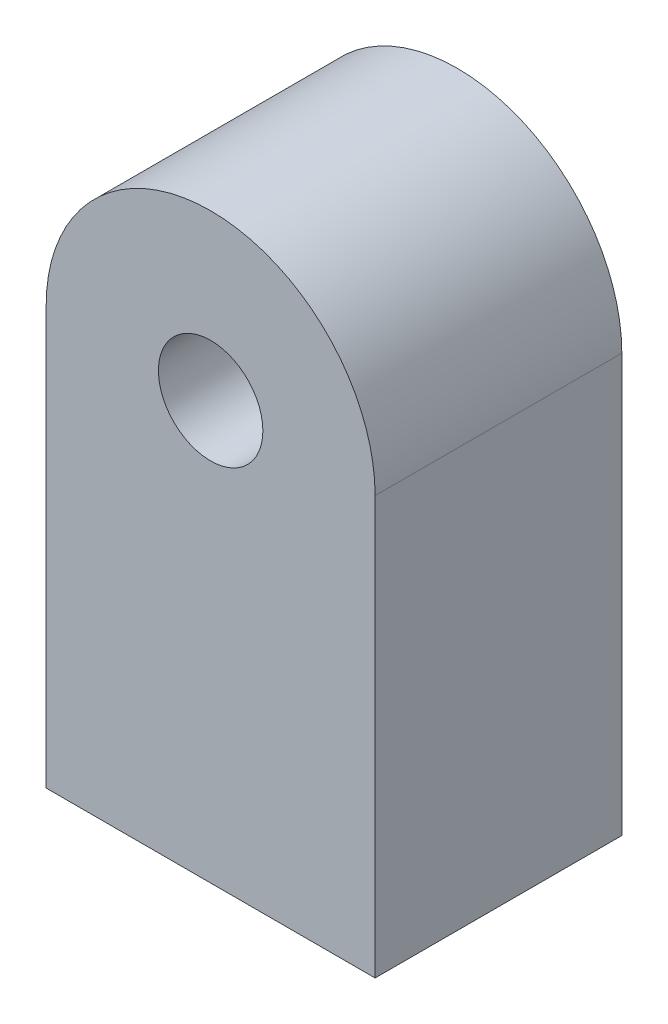
ISO-10303-21;
HEADER;
FILE_DESCRIPTION(('STEP AP214'),'2;1');
FILE_NAME('part.step','',(''),(''),'','','');
FILE_SCHEMA(('AUTOMOTIVE_DESIGN { 1 0 10303 214 1 1 1 1 }'));
ENDSEC;
DATA;
#1=APPLICATION_CONTEXT('core data for automotive mechanical design processes');
#2=APPLICATION_PROTOCOL_DEFINITION('international standard','automotive_design',2000,#1);
#3=PRODUCT_CONTEXT('',#1,'mechanical');
#4=PRODUCT('Part','Part','',(#3));
#5=PRODUCT_RELATED_PRODUCT_CATEGORY('part','',(#4));
#6=PRODUCT_DEFINITION_FORMATION('','',#4);
#7=PRODUCT_DEFINITION_CONTEXT('part definition',#1,'design');
#8=PRODUCT_DEFINITION('design','',#6,#7);
#9=PRODUCT_DEFINITION_SHAPE('','',#8);
#10=(LENGTH_UNIT() NAMED_UNIT(*) SI_UNIT(.MILLI.,.METRE.));
#11=(NAMED_UNIT(*) PLANE_ANGLE_UNIT() SI_UNIT($,.RADIAN.));
#12=(NAMED_UNIT(*) SI_UNIT($,.STERADIAN.) SOLID_ANGLE_UNIT());
#13=UNCERTAINTY_MEASURE_WITH_UNIT(LENGTH_MEASURE(1.E-05),#10,'distance_accuracy_value','');
#14=(GEOMETRIC_REPRESENTATION_CONTEXT(3) GLOBAL_UNCERTAINTY_ASSIGNED_CONTEXT((#13)) GLOBAL_UNIT_ASSIGNED_CONTEXT((#10,
#11,#12)) REPRESENTATION_CONTEXT('',''));
#15=CARTESIAN_POINT('',(0.,0.,0.));
#16=DIRECTION('',(0.,0.,1.));
#17=DIRECTION('',(1.,0.,0.));
#18=AXIS2_PLACEMENT_3D('',#15,#16,#17);
#19=CARTESIAN_POINT('',(0.,0.,15.));
#20=DIRECTION('',(0.,0.,1.));
#21=DIRECTION('',(1.,0.,0.));
#22=AXIS2_PLACEMENT_3D('',#19,#20,#21);
#23=PLANE('',#22);
#24=CARTESIAN_POINT('',(0.,0.,15.));
#25=DIRECTION('',(0.,0.,1.));
#26=DIRECTION('',(1.,0.,0.));
#27=AXIS2_PLACEMENT_3D('',#24,#25,#26);
#28=CIRCLE('',#27,10.);
#29=CARTESIAN_POINT('',(10.,0.,15.));
#30=VERTEX_POINT('',#29);
#31=CARTESIAN_POINT('',(-10.,0.,15.));
#32=VERTEX_POINT('',#31);
#33=EDGE_CURVE('E83',#30,#32,#28,.T.);
#34=ORIENTED_EDGE('',*,*,#33,.T.);
#35=DIRECTION('',(0.,-1.,0.));
#36=VECTOR('',#35,1.);
#37=CARTESIAN_POINT('',(-10.,0.,15.));
#38=LINE('',#37,#36);
#39=CARTESIAN_POINT('',(-10.,-25.4,15.));
#40=VERTEX_POINT('',#39);
#41=EDGE_CURVE('E78',#32,#40,#38,.T.);
#42=ORIENTED_EDGE('',*,*,#41,.T.);
#43=DIRECTION('',(1.,0.,0.));
#44=VECTOR('',#43,1.);
#45=CARTESIAN_POINT('',(-10.,-25.4,15.));
#46=LINE('',#45,#44);
#47=CARTESIAN_POINT('',(10.,-25.4,15.));
#48=VERTEX_POINT('',#47);
#49=EDGE_CURVE('E81',#40,#48,#46,.T.);
#50=ORIENTED_EDGE('',*,*,#49,.T.);
#51=DIRECTION('',(0.,1.,0.));
#52=VECTOR('',#51,1.);
#53=CARTESIAN_POINT('',(10.,0.,15.));
#54=LINE('',#53,#52);
#55=EDGE_CURVE('E48',#48,#30,#54,.T.);
#56=ORIENTED_EDGE('',*,*,#55,.T.);
#57=EDGE_LOOP('',(#34,#42,#50,#56));
#58=FACE_BOUND('',#57,.T.);
#59=CARTESIAN_POINT('',(0.,0.,15.));
#60=DIRECTION('',(0.,0.,1.));
#61=DIRECTION('',(1.,0.,0.));
#62=AXIS2_PLACEMENT_3D('',#59,#60,#61);
#63=CIRCLE('',#62,3.175);
#64=CARTESIAN_POINT('',(3.175,0.,15.));
#65=VERTEX_POINT('',#64);
#66=EDGE_CURVE('E98',#65,#65,#63,.T.);
#67=ORIENTED_EDGE('',*,*,#66,.F.);
#68=EDGE_LOOP('',(#67));
#69=FACE_BOUND('',#68,.T.);
#70=ADVANCED_FACE('F31',(#58,#69),#23,.T.);
#71=CARTESIAN_POINT('',(0.,0.,0.));
#72=DIRECTION('',(0.,0.,1.));
#73=DIRECTION('',(1.,0.,0.));
#74=AXIS2_PLACEMENT_3D('',#71,#72,#73);
#75=PLANE('',#74);
#76=CARTESIAN_POINT('',(0.,0.,0.));
#77=DIRECTION('',(0.,0.,1.));
#78=DIRECTION('',(1.,0.,0.));
#79=AXIS2_PLACEMENT_3D('',#76,#77,#78);
#80=CIRCLE('',#79,10.);
#81=CARTESIAN_POINT('',(10.,0.,0.));
#82=VERTEX_POINT('',#81);
#83=CARTESIAN_POINT('',(-10.,0.,0.));
#84=VERTEX_POINT('',#83);
#85=EDGE_CURVE('E95',#82,#84,#80,.T.);
#86=ORIENTED_EDGE('',*,*,#85,.F.);
#87=DIRECTION('',(0.,1.,0.));
#88=VECTOR('',#87,1.);
#89=CARTESIAN_POINT('',(10.,0.,0.));
#90=LINE('',#89,#88);
#91=CARTESIAN_POINT('',(10.,-25.4,0.));
#92=VERTEX_POINT('',#91);
#93=EDGE_CURVE('E71',#92,#82,#90,.T.);
#94=ORIENTED_EDGE('',*,*,#93,.F.);
#95=DIRECTION('',(1.,0.,0.));
#96=VECTOR('',#95,1.);
#97=CARTESIAN_POINT('',(-10.,-25.4,0.));
#98=LINE('',#97,#96);
#99=CARTESIAN_POINT('',(-10.,-25.4,0.));
#100=VERTEX_POINT('',#99);
#101=EDGE_CURVE('E65',#100,#92,#98,.T.);
#102=ORIENTED_EDGE('',*,*,#101,.F.);
#103=DIRECTION('',(0.,-1.,0.));
#104=VECTOR('',#103,1.);
#105=CARTESIAN_POINT('',(-10.,0.,0.));
#106=LINE('',#105,#104);
#107=EDGE_CURVE('E87',#84,#100,#106,.T.);
#108=ORIENTED_EDGE('',*,*,#107,.F.);
#109=EDGE_LOOP('',(#86,#94,#102,#108));
#110=FACE_BOUND('',#109,.T.);
#111=CARTESIAN_POINT('',(0.,0.,0.));
#112=DIRECTION('',(0.,0.,1.));
#113=DIRECTION('',(1.,0.,0.));
#114=AXIS2_PLACEMENT_3D('',#111,#112,#113);
#115=CIRCLE('',#114,3.175);
#116=CARTESIAN_POINT('',(3.175,0.,0.));
#117=VERTEX_POINT('',#116);
#118=EDGE_CURVE('E110',#117,#117,#115,.T.);
#119=ORIENTED_EDGE('',*,*,#118,.T.);
#120=EDGE_LOOP('',(#119));
#121=FACE_BOUND('',#120,.T.);
#122=ADVANCED_FACE('F106',(#110,#121),#75,.F.);
#123=CARTESIAN_POINT('',(0.,0.,15.));
#124=DIRECTION('',(0.,0.,-1.));
#125=DIRECTION('',(-1.,0.,0.));
#126=AXIS2_PLACEMENT_3D('',#123,#124,#125);
#127=CYLINDRICAL_SURFACE('',#126,10.);
#128=ORIENTED_EDGE('',*,*,#85,.T.);
#129=DIRECTION('',(0.,0.,-1.));
#130=VECTOR('',#129,1.);
#131=CARTESIAN_POINT('',(-10.,0.,15.));
#132=LINE('',#131,#130);
#133=EDGE_CURVE('E11',#32,#84,#132,.T.);
#134=ORIENTED_EDGE('',*,*,#133,.F.);
#135=ORIENTED_EDGE('',*,*,#33,.F.);
#136=DIRECTION('',(0.,0.,-1.));
#137=VECTOR('',#136,1.);
#138=CARTESIAN_POINT('',(10.,0.,15.));
#139=LINE('',#138,#137);
#140=EDGE_CURVE('E91',#30,#82,#139,.T.);
#141=ORIENTED_EDGE('',*,*,#140,.T.);
#142=EDGE_LOOP('',(#128,#134,#135,#141));
#143=FACE_BOUND('',#142,.T.);
#144=ADVANCED_FACE('F33',(#143),#127,.T.);
#145=CARTESIAN_POINT('',(-10.,0.,15.));
#146=DIRECTION('',(1.,0.,0.));
#147=DIRECTION('',(0.,1.,0.));
#148=AXIS2_PLACEMENT_3D('',#145,#146,#147);
#149=PLANE('',#148);
#150=ORIENTED_EDGE('',*,*,#107,.T.);
#151=DIRECTION('',(0.,0.,-1.));
#152=VECTOR('',#151,1.);
#153=CARTESIAN_POINT('',(-10.,-25.4,15.));
#154=LINE('',#153,#152);
#155=EDGE_CURVE('E40',#40,#100,#154,.T.);
#156=ORIENTED_EDGE('',*,*,#155,.F.);
#157=ORIENTED_EDGE('',*,*,#41,.F.);
#158=ORIENTED_EDGE('',*,*,#133,.T.);
#159=EDGE_LOOP('',(#150,#156,#157,#158));
#160=FACE_BOUND('',#159,.T.);
#161=ADVANCED_FACE('F86',(#160),#149,.F.);
#162=CARTESIAN_POINT('',(-10.,-25.4,15.));
#163=DIRECTION('',(0.,1.,0.));
#164=DIRECTION('',(0.,0.,1.));
#165=AXIS2_PLACEMENT_3D('',#162,#163,#164);
#166=PLANE('',#165);
#167=CARTESIAN_POINT('',(0.,-25.4,7.5));
#168=DIRECTION('',(0.,-1.,0.));
#169=DIRECTION('',(0.,0.,-1.));
#170=AXIS2_PLACEMENT_3D('',#167,#168,#169);
#171=CIRCLE('',#170,3.175);
#172=CARTESIAN_POINT('',(0.,-25.4,4.325));
#173=VERTEX_POINT('',#172);
#174=EDGE_CURVE('E116',#173,#173,#171,.T.);
#175=ORIENTED_EDGE('',*,*,#174,.F.);
#176=EDGE_LOOP('',(#175));
#177=FACE_BOUND('',#176,.T.);
#178=ORIENTED_EDGE('',*,*,#101,.T.);
#179=DIRECTION('',(0.,0.,-1.));
#180=VECTOR('',#179,1.);
#181=CARTESIAN_POINT('',(10.,-25.4,15.));
#182=LINE('',#181,#180);
#183=EDGE_CURVE('E88',#48,#92,#182,.T.);
#184=ORIENTED_EDGE('',*,*,#183,.F.);
#185=ORIENTED_EDGE('',*,*,#49,.F.);
#186=ORIENTED_EDGE('',*,*,#155,.T.);
#187=EDGE_LOOP('',(#178,#184,#185,#186));
#188=FACE_BOUND('',#187,.T.);
#189=ADVANCED_FACE('F89',(#177,#188),#166,.F.);
#190=CARTESIAN_POINT('',(10.,0.,15.));
#191=DIRECTION('',(-1.,0.,0.));
#192=DIRECTION('',(0.,-1.,0.));
#193=AXIS2_PLACEMENT_3D('',#190,#191,#192);
#194=PLANE('',#193);
#195=ORIENTED_EDGE('',*,*,#93,.T.);
#196=ORIENTED_EDGE('',*,*,#140,.F.);
#197=ORIENTED_EDGE('',*,*,#55,.F.);
#198=ORIENTED_EDGE('',*,*,#183,.T.);
#199=EDGE_LOOP('',(#195,#196,#197,#198));
#200=FACE_BOUND('',#199,.T.);
#201=ADVANCED_FACE('F103',(#200),#194,.F.);
#202=CARTESIAN_POINT('',(0.,0.,15.));
#203=DIRECTION('',(0.,0.,-1.));
#204=DIRECTION('',(-1.,0.,0.));
#205=AXIS2_PLACEMENT_3D('',#202,#203,#204);
#206=CYLINDRICAL_SURFACE('',#205,3.175);
#207=ORIENTED_EDGE('',*,*,#66,.T.);
#208=EDGE_LOOP('',(#207));
#209=FACE_BOUND('',#208,.T.);
#210=ORIENTED_EDGE('',*,*,#118,.F.);
#211=EDGE_LOOP('',(#210));
#212=FACE_BOUND('',#211,.T.);
#213=ADVANCED_FACE('F127',(#209,#212),#206,.F.);
#214=CARTESIAN_POINT('',(0.,-10.4,7.5));
#215=DIRECTION('',(0.,-1.,0.));
#216=DIRECTION('',(0.,0.,-1.));
#217=AXIS2_PLACEMENT_3D('',#214,#215,#216);
#218=CYLINDRICAL_SURFACE('',#217,3.175);
#219=CARTESIAN_POINT('',(0.,-10.4,7.5));
#220=DIRECTION('',(0.,-1.,0.));
#221=DIRECTION('',(0.,0.,-1.));
#222=AXIS2_PLACEMENT_3D('',#219,#220,#221);
#223=CIRCLE('',#222,3.175);
#224=CARTESIAN_POINT('',(0.,-10.4,4.325));
#225=VERTEX_POINT('',#224);
#226=EDGE_CURVE('E113',#225,#225,#223,.T.);
#227=ORIENTED_EDGE('',*,*,#226,.F.);
#228=EDGE_LOOP('',(#227));
#229=FACE_BOUND('',#228,.T.);
#230=ORIENTED_EDGE('',*,*,#174,.T.);
#231=EDGE_LOOP('',(#230));
#232=FACE_BOUND('',#231,.T.);
#233=ADVANCED_FACE('F124',(#229,#232),#218,.F.);
#234=CARTESIAN_POINT('',(0.,-10.4,7.5));
#235=DIRECTION('',(0.,-1.,0.));
#236=DIRECTION('',(0.,0.,-1.));
#237=AXIS2_PLACEMENT_3D('',#234,#235,#236);
#238=PLANE('',#237);
#239=ORIENTED_EDGE('',*,*,#226,.T.);
#240=EDGE_LOOP('',(#239));
#241=FACE_BOUND('',#240,.T.);
#242=ADVANCED_FACE('F122',(#241),#238,.T.);
#243=CLOSED_SHELL('',(#70,#122,#144,#161,#189,#201,#213,#233,#242));
#244=MANIFOLD_SOLID_BREP('B2',#243);
#245=ADVANCED_BREP_SHAPE_REPRESENTATION('',(#18,#244),#14);
#246=SHAPE_DEFINITION_REPRESENTATION(#9,#245);
ENDSEC;
END-ISO-10303-21;
